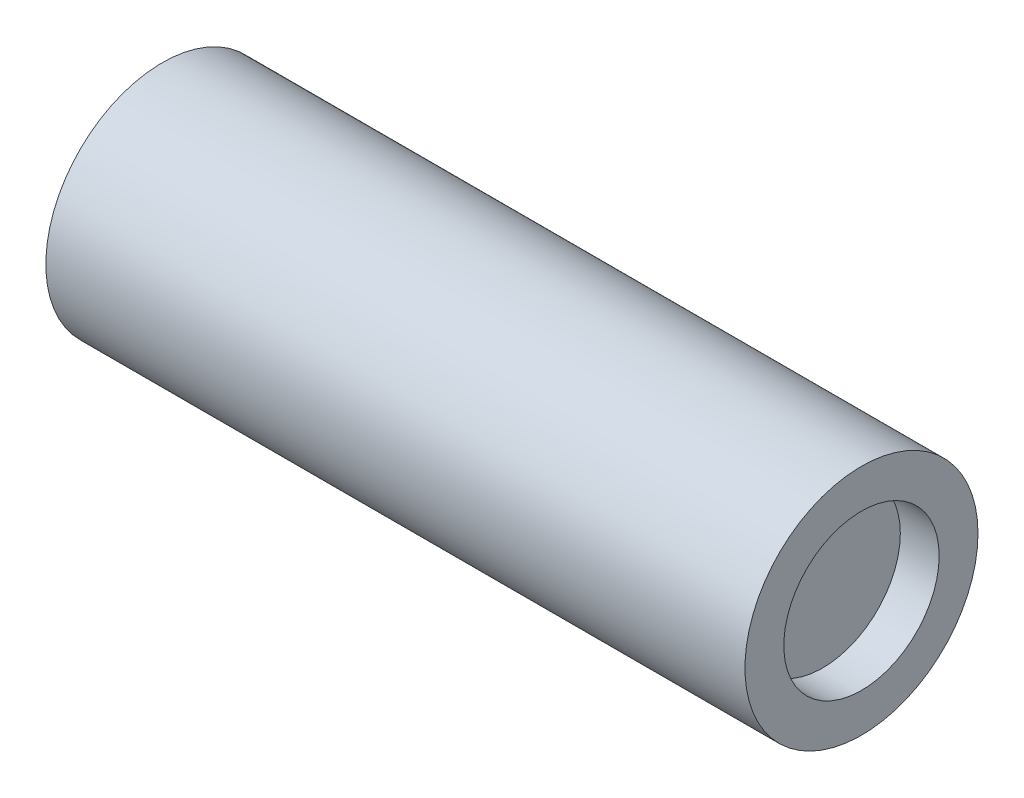
ISO-10303-21;
HEADER;
FILE_DESCRIPTION(('STEP AP214'),'2;1');
FILE_NAME('part.step','',(''),(''),'','','');
FILE_SCHEMA(('AUTOMOTIVE_DESIGN { 1 0 10303 214 1 1 1 1 }'));
ENDSEC;
DATA;
#1=APPLICATION_CONTEXT('core data for automotive mechanical design processes');
#2=APPLICATION_PROTOCOL_DEFINITION('international standard','automotive_design',2000,#1);
#3=PRODUCT_CONTEXT('',#1,'mechanical');
#4=PRODUCT('Part','Part','',(#3));
#5=PRODUCT_RELATED_PRODUCT_CATEGORY('part','',(#4));
#6=PRODUCT_DEFINITION_FORMATION('','',#4);
#7=PRODUCT_DEFINITION_CONTEXT('part definition',#1,'design');
#8=PRODUCT_DEFINITION('design','',#6,#7);
#9=PRODUCT_DEFINITION_SHAPE('','',#8);
#10=(LENGTH_UNIT() NAMED_UNIT(*) SI_UNIT(.MILLI.,.METRE.));
#11=(NAMED_UNIT(*) PLANE_ANGLE_UNIT() SI_UNIT($,.RADIAN.));
#12=(NAMED_UNIT(*) SI_UNIT($,.STERADIAN.) SOLID_ANGLE_UNIT());
#13=UNCERTAINTY_MEASURE_WITH_UNIT(LENGTH_MEASURE(1.E-05),#10,'distance_accuracy_value','');
#14=(GEOMETRIC_REPRESENTATION_CONTEXT(3) GLOBAL_UNCERTAINTY_ASSIGNED_CONTEXT((#13)) GLOBAL_UNIT_ASSIGNED_CONTEXT((#10,
#11,#12)) REPRESENTATION_CONTEXT('',''));
#15=CARTESIAN_POINT('',(0.,0.,0.));
#16=DIRECTION('',(0.,0.,1.));
#17=DIRECTION('',(1.,0.,0.));
#18=AXIS2_PLACEMENT_3D('',#15,#16,#17);
#19=CARTESIAN_POINT('',(36.,0.,0.));
#20=DIRECTION('',(-1.,0.,0.));
#21=DIRECTION('',(0.,0.,1.));
#22=AXIS2_PLACEMENT_3D('',#19,#20,#21);
#23=CYLINDRICAL_SURFACE('',#22,6.);
#24=CARTESIAN_POINT('',(36.,0.,0.));
#25=DIRECTION('',(1.,0.,0.));
#26=DIRECTION('',(0.,0.,-1.));
#27=AXIS2_PLACEMENT_3D('',#24,#25,#26);
#28=CIRCLE('',#27,6.);
#29=CARTESIAN_POINT('',(36.,0.,-6.));
#30=VERTEX_POINT('',#29);
#31=EDGE_CURVE('E10',#30,#30,#28,.T.);
#32=ORIENTED_EDGE('',*,*,#31,.F.);
#33=EDGE_LOOP('',(#32));
#34=FACE_BOUND('',#33,.T.);
#35=CARTESIAN_POINT('',(0.,0.,0.));
#36=DIRECTION('',(1.,0.,0.));
#37=DIRECTION('',(0.,0.,-1.));
#38=AXIS2_PLACEMENT_3D('',#35,#36,#37);
#39=CIRCLE('',#38,6.);
#40=CARTESIAN_POINT('',(0.,0.,-6.));
#41=VERTEX_POINT('',#40);
#42=EDGE_CURVE('E42',#41,#41,#39,.T.);
#43=ORIENTED_EDGE('',*,*,#42,.T.);
#44=EDGE_LOOP('',(#43));
#45=FACE_BOUND('',#44,.T.);
#46=ADVANCED_FACE('F39',(#34,#45),#23,.T.);
#47=CARTESIAN_POINT('',(36.,0.,0.));
#48=DIRECTION('',(1.,0.,0.));
#49=DIRECTION('',(0.,0.,-1.));
#50=AXIS2_PLACEMENT_3D('',#47,#48,#49);
#51=PLANE('',#50);
#52=CARTESIAN_POINT('',(36.,0.,0.));
#53=DIRECTION('',(1.,0.,0.));
#54=DIRECTION('',(0.,0.,-1.));
#55=AXIS2_PLACEMENT_3D('',#52,#53,#54);
#56=CIRCLE('',#55,4.);
#57=CARTESIAN_POINT('',(36.,0.,-4.));
#58=VERTEX_POINT('',#57);
#59=EDGE_CURVE('E53',#58,#58,#56,.T.);
#60=ORIENTED_EDGE('',*,*,#59,.F.);
#61=EDGE_LOOP('',(#60));
#62=FACE_BOUND('',#61,.T.);
#63=ORIENTED_EDGE('',*,*,#31,.T.);
#64=EDGE_LOOP('',(#63));
#65=FACE_BOUND('',#64,.T.);
#66=ADVANCED_FACE('F89',(#62,#65),#51,.T.);
#67=CARTESIAN_POINT('',(0.,0.,0.));
#68=DIRECTION('',(1.,0.,0.));
#69=DIRECTION('',(0.,0.,-1.));
#70=AXIS2_PLACEMENT_3D('',#67,#68,#69);
#71=PLANE('',#70);
#72=CARTESIAN_POINT('',(0.,0.,0.51));
#73=DIRECTION('',(1.,0.,0.));
#74=DIRECTION('',(0.,0.,1.));
#75=AXIS2_PLACEMENT_3D('',#72,#73,#74);
#76=CIRCLE('',#75,0.5);
#77=CARTESIAN_POINT('',(0.,0.,1.01));
#78=VERTEX_POINT('',#77);
#79=EDGE_CURVE('E69',#78,#78,#76,.T.);
#80=ORIENTED_EDGE('',*,*,#79,.T.);
#81=EDGE_LOOP('',(#80));
#82=FACE_BOUND('',#81,.T.);
#83=CARTESIAN_POINT('',(0.,0.,-0.51));
#84=DIRECTION('',(1.,0.,0.));
#85=DIRECTION('',(0.,0.,-1.));
#86=AXIS2_PLACEMENT_3D('',#83,#84,#85);
#87=CIRCLE('',#86,0.5);
#88=CARTESIAN_POINT('',(0.,0.,-1.01));
#89=VERTEX_POINT('',#88);
#90=EDGE_CURVE('E61',#89,#89,#87,.T.);
#91=ORIENTED_EDGE('',*,*,#90,.T.);
#92=EDGE_LOOP('',(#91));
#93=FACE_BOUND('',#92,.T.);
#94=ORIENTED_EDGE('',*,*,#42,.F.);
#95=EDGE_LOOP('',(#94));
#96=FACE_BOUND('',#95,.T.);
#97=ADVANCED_FACE('F94',(#82,#93,#96),#71,.F.);
#98=CARTESIAN_POINT('',(34.,0.,0.));
#99=DIRECTION('',(1.,0.,0.));
#100=DIRECTION('',(0.,0.,-1.));
#101=AXIS2_PLACEMENT_3D('',#98,#99,#100);
#102=CYLINDRICAL_SURFACE('',#101,4.);
#103=CARTESIAN_POINT('',(34.,0.,0.));
#104=DIRECTION('',(1.,0.,0.));
#105=DIRECTION('',(0.,0.,-1.));
#106=AXIS2_PLACEMENT_3D('',#103,#104,#105);
#107=CIRCLE('',#106,4.);
#108=CARTESIAN_POINT('',(34.,0.,-4.));
#109=VERTEX_POINT('',#108);
#110=EDGE_CURVE('E51',#109,#109,#107,.T.);
#111=ORIENTED_EDGE('',*,*,#110,.F.);
#112=EDGE_LOOP('',(#111));
#113=FACE_BOUND('',#112,.T.);
#114=ORIENTED_EDGE('',*,*,#59,.T.);
#115=EDGE_LOOP('',(#114));
#116=FACE_BOUND('',#115,.T.);
#117=ADVANCED_FACE('F101',(#113,#116),#102,.F.);
#118=CARTESIAN_POINT('',(34.,0.,0.));
#119=DIRECTION('',(1.,0.,0.));
#120=DIRECTION('',(0.,0.,-1.));
#121=AXIS2_PLACEMENT_3D('',#118,#119,#120);
#122=PLANE('',#121);
#123=ORIENTED_EDGE('',*,*,#110,.T.);
#124=EDGE_LOOP('',(#123));
#125=FACE_BOUND('',#124,.T.);
#126=ADVANCED_FACE('F106',(#125),#122,.T.);
#127=CARTESIAN_POINT('',(-3.,0.,-0.51));
#128=DIRECTION('',(1.,0.,0.));
#129=DIRECTION('',(0.,0.,-1.));
#130=AXIS2_PLACEMENT_3D('',#127,#128,#129);
#131=CYLINDRICAL_SURFACE('',#130,0.5);
#132=CARTESIAN_POINT('',(-3.,0.,-0.51));
#133=DIRECTION('',(1.,0.,0.));
#134=DIRECTION('',(0.,0.,-1.));
#135=AXIS2_PLACEMENT_3D('',#132,#133,#134);
#136=CIRCLE('',#135,0.5);
#137=CARTESIAN_POINT('',(-3.,0.,-1.01));
#138=VERTEX_POINT('',#137);
#139=EDGE_CURVE('E57',#138,#138,#136,.T.);
#140=ORIENTED_EDGE('',*,*,#139,.T.);
#141=EDGE_LOOP('',(#140));
#142=FACE_BOUND('',#141,.T.);
#143=ORIENTED_EDGE('',*,*,#90,.F.);
#144=EDGE_LOOP('',(#143));
#145=FACE_BOUND('',#144,.T.);
#146=ADVANCED_FACE('F113',(#142,#145),#131,.T.);
#147=CARTESIAN_POINT('',(-3.,0.,-0.51));
#148=DIRECTION('',(1.,0.,0.));
#149=DIRECTION('',(0.,0.,-1.));
#150=AXIS2_PLACEMENT_3D('',#147,#148,#149);
#151=PLANE('',#150);
#152=ORIENTED_EDGE('',*,*,#139,.F.);
#153=EDGE_LOOP('',(#152));
#154=FACE_BOUND('',#153,.T.);
#155=ADVANCED_FACE('F86',(#154),#151,.F.);
#156=CARTESIAN_POINT('',(-3.,0.,0.51));
#157=DIRECTION('',(1.,0.,0.));
#158=DIRECTION('',(0.,0.,-1.));
#159=AXIS2_PLACEMENT_3D('',#156,#157,#158);
#160=CYLINDRICAL_SURFACE('',#159,0.5);
#161=CARTESIAN_POINT('',(-3.,0.,0.51));
#162=DIRECTION('',(1.,0.,0.));
#163=DIRECTION('',(0.,0.,1.));
#164=AXIS2_PLACEMENT_3D('',#161,#162,#163);
#165=CIRCLE('',#164,0.5);
#166=CARTESIAN_POINT('',(-3.,0.,1.01));
#167=VERTEX_POINT('',#166);
#168=EDGE_CURVE('E65',#167,#167,#165,.T.);
#169=ORIENTED_EDGE('',*,*,#168,.T.);
#170=EDGE_LOOP('',(#169));
#171=FACE_BOUND('',#170,.T.);
#172=ORIENTED_EDGE('',*,*,#79,.F.);
#173=EDGE_LOOP('',(#172));
#174=FACE_BOUND('',#173,.T.);
#175=ADVANCED_FACE('F77',(#171,#174),#160,.T.);
#176=CARTESIAN_POINT('',(-3.,0.,0.51));
#177=DIRECTION('',(-1.,0.,0.));
#178=DIRECTION('',(0.,0.,1.));
#179=AXIS2_PLACEMENT_3D('',#176,#177,#178);
#180=PLANE('',#179);
#181=ORIENTED_EDGE('',*,*,#168,.F.);
#182=EDGE_LOOP('',(#181));
#183=FACE_BOUND('',#182,.T.);
#184=ADVANCED_FACE('F80',(#183),#180,.T.);
#185=CLOSED_SHELL('',(#46,#66,#97,#117,#126,#146,#155,#175,#184));
#186=MANIFOLD_SOLID_BREP('B2',#185);
#187=ADVANCED_BREP_SHAPE_REPRESENTATION('',(#18,#186),#14);
#188=SHAPE_DEFINITION_REPRESENTATION(#9,#187);
ENDSEC;
END-ISO-10303-21;
